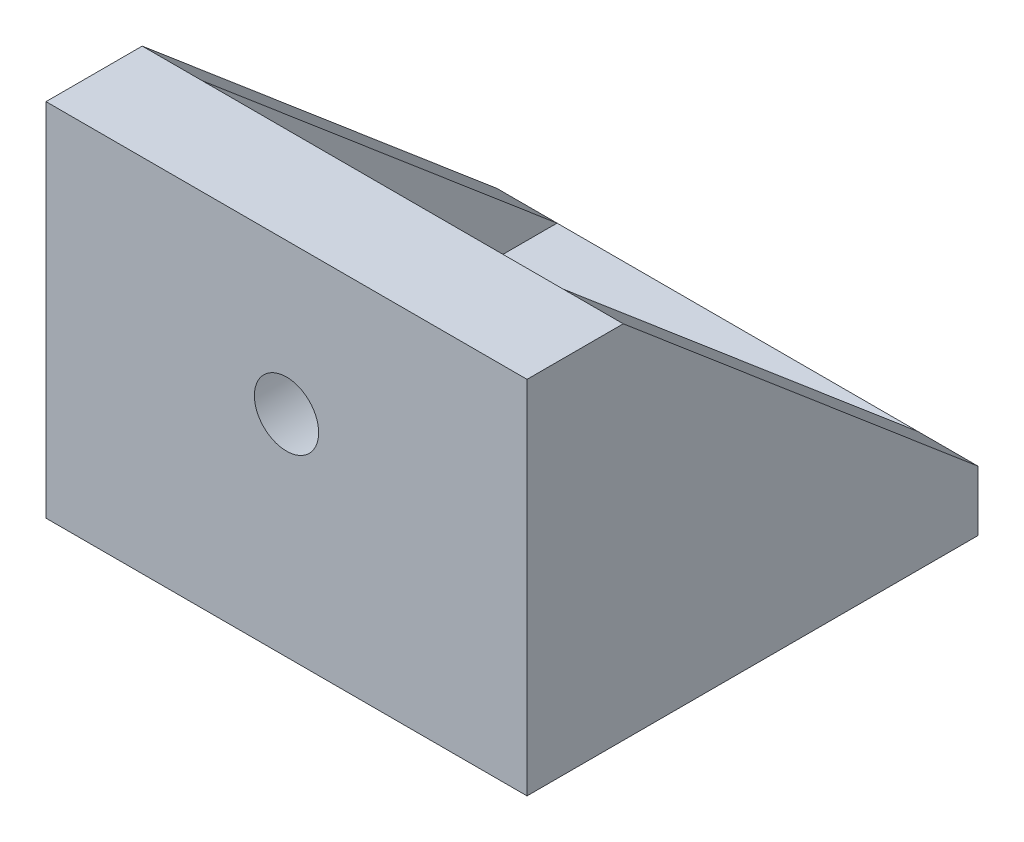
ISO-10303-21;
HEADER;
FILE_DESCRIPTION(('STEP AP214'),'2;1');
FILE_NAME('part.step','',(''),(''),'','','');
FILE_SCHEMA(('AUTOMOTIVE_DESIGN { 1 0 10303 214 1 1 1 1 }'));
ENDSEC;
DATA;
#1=APPLICATION_CONTEXT('core data for automotive mechanical design processes');
#2=APPLICATION_PROTOCOL_DEFINITION('international standard','automotive_design',2000,#1);
#3=PRODUCT_CONTEXT('',#1,'mechanical');
#4=PRODUCT('Part','Part','',(#3));
#5=PRODUCT_RELATED_PRODUCT_CATEGORY('part','',(#4));
#6=PRODUCT_DEFINITION_FORMATION('','',#4);
#7=PRODUCT_DEFINITION_CONTEXT('part definition',#1,'design');
#8=PRODUCT_DEFINITION('design','',#6,#7);
#9=PRODUCT_DEFINITION_SHAPE('','',#8);
#10=(LENGTH_UNIT() NAMED_UNIT(*) SI_UNIT(.MILLI.,.METRE.));
#11=(NAMED_UNIT(*) PLANE_ANGLE_UNIT() SI_UNIT($,.RADIAN.));
#12=(NAMED_UNIT(*) SI_UNIT($,.STERADIAN.) SOLID_ANGLE_UNIT());
#13=UNCERTAINTY_MEASURE_WITH_UNIT(LENGTH_MEASURE(1.E-05),#10,'distance_accuracy_value','');
#14=(GEOMETRIC_REPRESENTATION_CONTEXT(3) GLOBAL_UNCERTAINTY_ASSIGNED_CONTEXT((#13)) GLOBAL_UNIT_ASSIGNED_CONTEXT((#10,
#11,#12)) REPRESENTATION_CONTEXT('',''));
#15=CARTESIAN_POINT('',(0.,0.,0.));
#16=DIRECTION('',(0.,0.,1.));
#17=DIRECTION('',(1.,0.,0.));
#18=AXIS2_PLACEMENT_3D('',#15,#16,#17);
#19=CARTESIAN_POINT('',(0.,5.,0.));
#20=DIRECTION('',(0.,1.,0.));
#21=DIRECTION('',(0.,0.,1.));
#22=AXIS2_PLACEMENT_3D('',#19,#20,#21);
#23=PLANE('',#22);
#24=CARTESIAN_POINT('',(0.,5.,-11.5));
#25=DIRECTION('',(0.,1.,0.));
#26=DIRECTION('',(0.,0.,1.));
#27=AXIS2_PLACEMENT_3D('',#24,#25,#26);
#28=CIRCLE('',#27,3.15);
#29=CARTESIAN_POINT('',(0.,5.,-8.34999999999999));
#30=VERTEX_POINT('',#29);
#31=EDGE_CURVE('E175',#30,#30,#28,.T.);
#32=ORIENTED_EDGE('',*,*,#31,.F.);
#33=EDGE_LOOP('',(#32));
#34=FACE_BOUND('',#33,.T.);
#35=CARTESIAN_POINT('',(-8.6602540378444,5.,3.49999999999999));
#36=DIRECTION('',(0.,1.,0.));
#37=DIRECTION('',(0.,0.,1.));
#38=AXIS2_PLACEMENT_3D('',#35,#36,#37);
#39=CIRCLE('',#38,3.15);
#40=CARTESIAN_POINT('',(-8.6602540378444,5.,6.64999999999999));
#41=VERTEX_POINT('',#40);
#42=EDGE_CURVE('E168',#41,#41,#39,.T.);
#43=ORIENTED_EDGE('',*,*,#42,.F.);
#44=EDGE_LOOP('',(#43));
#45=FACE_BOUND('',#44,.T.);
#46=CARTESIAN_POINT('',(8.6602540378444,5.,3.49999999999999));
#47=DIRECTION('',(0.,1.,0.));
#48=DIRECTION('',(0.,0.,1.));
#49=AXIS2_PLACEMENT_3D('',#46,#47,#48);
#50=CIRCLE('',#49,3.15);
#51=CARTESIAN_POINT('',(8.6602540378444,5.,6.64999999999999));
#52=VERTEX_POINT('',#51);
#53=EDGE_CURVE('E164',#52,#52,#50,.T.);
#54=ORIENTED_EDGE('',*,*,#53,.F.);
#55=EDGE_LOOP('',(#54));
#56=FACE_BOUND('',#55,.T.);
#57=DIRECTION('',(-1.,0.,0.));
#58=VECTOR('',#57,1.);
#59=CARTESIAN_POINT('',(-20.,5.,-18.75));
#60=LINE('',#59,#58);
#61=CARTESIAN_POINT('',(15.,5.,-18.75));
#62=VERTEX_POINT('',#61);
#63=CARTESIAN_POINT('',(-15.,5.,-18.75));
#64=VERTEX_POINT('',#63);
#65=EDGE_CURVE('E134',#62,#64,#60,.T.);
#66=ORIENTED_EDGE('',*,*,#65,.T.);
#67=DIRECTION('',(0.,0.,-1.));
#68=VECTOR('',#67,1.);
#69=CARTESIAN_POINT('',(-15.,5.,-18.75));
#70=LINE('',#69,#68);
#71=CARTESIAN_POINT('',(-15.,5.,10.75));
#72=VERTEX_POINT('',#71);
#73=EDGE_CURVE('E120',#72,#64,#70,.T.);
#74=ORIENTED_EDGE('',*,*,#73,.F.);
#75=DIRECTION('',(-1.,0.,0.));
#76=VECTOR('',#75,1.);
#77=CARTESIAN_POINT('',(0.,5.,10.75));
#78=LINE('',#77,#76);
#79=CARTESIAN_POINT('',(15.,5.,10.75));
#80=VERTEX_POINT('',#79);
#81=EDGE_CURVE('E201',#80,#72,#78,.T.);
#82=ORIENTED_EDGE('',*,*,#81,.F.);
#83=DIRECTION('',(0.,0.,-1.));
#84=VECTOR('',#83,1.);
#85=CARTESIAN_POINT('',(15.,5.,-18.75));
#86=LINE('',#85,#84);
#87=EDGE_CURVE('E138',#80,#62,#86,.T.);
#88=ORIENTED_EDGE('',*,*,#87,.T.);
#89=EDGE_LOOP('',(#66,#74,#82,#88));
#90=FACE_BOUND('',#89,.T.);
#91=ADVANCED_FACE('F41',(#34,#45,#56,#90),#23,.T.);
#92=CARTESIAN_POINT('',(0.,0.,10.75));
#93=DIRECTION('',(0.,0.,1.));
#94=DIRECTION('',(1.,0.,0.));
#95=AXIS2_PLACEMENT_3D('',#92,#93,#94);
#96=PLANE('',#95);
#97=CARTESIAN_POINT('',(0.,17.5,10.75));
#98=DIRECTION('',(0.,0.,-1.));
#99=DIRECTION('',(-1.,0.,0.));
#100=AXIS2_PLACEMENT_3D('',#97,#98,#99);
#101=CIRCLE('',#100,6.);
#102=CARTESIAN_POINT('',(-6.00000000000002,17.5,10.75));
#103=VERTEX_POINT('',#102);
#104=EDGE_CURVE('E420',#103,#103,#101,.T.);
#105=ORIENTED_EDGE('',*,*,#104,.F.);
#106=EDGE_LOOP('',(#105));
#107=FACE_BOUND('',#106,.T.);
#108=DIRECTION('',(0.,-1.,0.));
#109=VECTOR('',#108,1.);
#110=CARTESIAN_POINT('',(-15.,5.,10.75));
#111=LINE('',#110,#109);
#112=CARTESIAN_POINT('',(-15.,30.,10.75));
#113=VERTEX_POINT('',#112);
#114=EDGE_CURVE('E119',#113,#72,#111,.T.);
#115=ORIENTED_EDGE('',*,*,#114,.F.);
#116=DIRECTION('',(-1.,0.,0.));
#117=VECTOR('',#116,1.);
#118=CARTESIAN_POINT('',(0.,30.,10.75));
#119=LINE('',#118,#117);
#120=CARTESIAN_POINT('',(15.,30.,10.75));
#121=VERTEX_POINT('',#120);
#122=EDGE_CURVE('E203',#121,#113,#119,.T.);
#123=ORIENTED_EDGE('',*,*,#122,.F.);
#124=DIRECTION('',(0.,-1.,0.));
#125=VECTOR('',#124,1.);
#126=CARTESIAN_POINT('',(15.,5.,10.75));
#127=LINE('',#126,#125);
#128=EDGE_CURVE('E192',#121,#80,#127,.T.);
#129=ORIENTED_EDGE('',*,*,#128,.T.);
#130=ORIENTED_EDGE('',*,*,#81,.T.);
#131=EDGE_LOOP('',(#115,#123,#129,#130));
#132=FACE_BOUND('',#131,.T.);
#133=ADVANCED_FACE('F229',(#107,#132),#96,.F.);
#134=CARTESIAN_POINT('',(20.,5.,-18.75));
#135=DIRECTION('',(-1.,0.,0.));
#136=DIRECTION('',(0.,0.,1.));
#137=AXIS2_PLACEMENT_3D('',#134,#135,#136);
#138=PLANE('',#137);
#139=DIRECTION('',(0.,-1.,0.));
#140=VECTOR('',#139,1.);
#141=CARTESIAN_POINT('',(20.,5.,-18.75));
#142=LINE('',#141,#140);
#143=CARTESIAN_POINT('',(20.,5.,-18.75));
#144=VERTEX_POINT('',#143);
#145=CARTESIAN_POINT('',(20.,0.,-18.75));
#146=VERTEX_POINT('',#145);
#147=EDGE_CURVE('E11',#144,#146,#142,.T.);
#148=ORIENTED_EDGE('',*,*,#147,.F.);
#149=DIRECTION('',(0.,0.646521695401615,0.762895600573906));
#150=VECTOR('',#149,1.);
#151=CARTESIAN_POINT('',(20.,30.,10.75));
#152=LINE('',#151,#150);
#153=CARTESIAN_POINT('',(20.,30.,10.75));
#154=VERTEX_POINT('',#153);
#155=EDGE_CURVE('E135',#144,#154,#152,.T.);
#156=ORIENTED_EDGE('',*,*,#155,.T.);
#157=DIRECTION('',(0.,0.,1.));
#158=VECTOR('',#157,1.);
#159=CARTESIAN_POINT('',(20.,30.,10.75));
#160=LINE('',#159,#158);
#161=CARTESIAN_POINT('',(20.,30.,18.75));
#162=VERTEX_POINT('',#161);
#163=EDGE_CURVE('E145',#154,#162,#160,.T.);
#164=ORIENTED_EDGE('',*,*,#163,.T.);
#165=DIRECTION('',(0.,-1.,0.));
#166=VECTOR('',#165,1.);
#167=CARTESIAN_POINT('',(20.,5.,18.75));
#168=LINE('',#167,#166);
#169=CARTESIAN_POINT('',(20.,0.,18.75));
#170=VERTEX_POINT('',#169);
#171=EDGE_CURVE('E141',#162,#170,#168,.T.);
#172=ORIENTED_EDGE('',*,*,#171,.T.);
#173=DIRECTION('',(0.,0.,-1.));
#174=VECTOR('',#173,1.);
#175=CARTESIAN_POINT('',(20.,0.,-18.75));
#176=LINE('',#175,#174);
#177=EDGE_CURVE('E147',#170,#146,#176,.T.);
#178=ORIENTED_EDGE('',*,*,#177,.T.);
#179=EDGE_LOOP('',(#148,#156,#164,#172,#178));
#180=FACE_BOUND('',#179,.T.);
#181=ADVANCED_FACE('F43',(#180),#138,.F.);
#182=CARTESIAN_POINT('',(-20.,5.,-18.75));
#183=DIRECTION('',(0.,0.,1.));
#184=DIRECTION('',(1.,0.,0.));
#185=AXIS2_PLACEMENT_3D('',#182,#183,#184);
#186=PLANE('',#185);
#187=DIRECTION('',(-1.,0.,0.));
#188=VECTOR('',#187,1.);
#189=CARTESIAN_POINT('',(-20.,0.,-18.75));
#190=LINE('',#189,#188);
#191=CARTESIAN_POINT('',(-20.,0.,-18.75));
#192=VERTEX_POINT('',#191);
#193=EDGE_CURVE('E150',#146,#192,#190,.T.);
#194=ORIENTED_EDGE('',*,*,#193,.T.);
#195=DIRECTION('',(0.,-1.,0.));
#196=VECTOR('',#195,1.);
#197=CARTESIAN_POINT('',(-20.,5.,-18.75));
#198=LINE('',#197,#196);
#199=CARTESIAN_POINT('',(-20.,5.,-18.75));
#200=VERTEX_POINT('',#199);
#201=EDGE_CURVE('E50',#200,#192,#198,.T.);
#202=ORIENTED_EDGE('',*,*,#201,.F.);
#203=DIRECTION('',(-1.,0.,0.));
#204=VECTOR('',#203,1.);
#205=CARTESIAN_POINT('',(-15.,5.,-18.75));
#206=LINE('',#205,#204);
#207=EDGE_CURVE('E113',#64,#200,#206,.T.);
#208=ORIENTED_EDGE('',*,*,#207,.F.);
#209=ORIENTED_EDGE('',*,*,#65,.F.);
#210=EDGE_CURVE('E139',#144,#62,#60,.T.);
#211=ORIENTED_EDGE('',*,*,#210,.F.);
#212=ORIENTED_EDGE('',*,*,#147,.T.);
#213=EDGE_LOOP('',(#194,#202,#208,#209,#211,#212));
#214=FACE_BOUND('',#213,.T.);
#215=ADVANCED_FACE('F132',(#214),#186,.F.);
#216=CARTESIAN_POINT('',(-20.,5.,-18.75));
#217=DIRECTION('',(1.,0.,0.));
#218=DIRECTION('',(0.,0.,-1.));
#219=AXIS2_PLACEMENT_3D('',#216,#217,#218);
#220=PLANE('',#219);
#221=DIRECTION('',(0.,0.,1.));
#222=VECTOR('',#221,1.);
#223=CARTESIAN_POINT('',(-20.,0.,-18.75));
#224=LINE('',#223,#222);
#225=CARTESIAN_POINT('',(-20.,0.,18.75));
#226=VERTEX_POINT('',#225);
#227=EDGE_CURVE('E66',#192,#226,#224,.T.);
#228=ORIENTED_EDGE('',*,*,#227,.T.);
#229=DIRECTION('',(0.,-1.,0.));
#230=VECTOR('',#229,1.);
#231=CARTESIAN_POINT('',(-20.,5.,18.75));
#232=LINE('',#231,#230);
#233=CARTESIAN_POINT('',(-20.,30.,18.75));
#234=VERTEX_POINT('',#233);
#235=EDGE_CURVE('E155',#234,#226,#232,.T.);
#236=ORIENTED_EDGE('',*,*,#235,.F.);
#237=DIRECTION('',(0.,0.,1.));
#238=VECTOR('',#237,1.);
#239=CARTESIAN_POINT('',(-20.,30.,10.75));
#240=LINE('',#239,#238);
#241=CARTESIAN_POINT('',(-20.,30.,10.75));
#242=VERTEX_POINT('',#241);
#243=EDGE_CURVE('E151',#242,#234,#240,.T.);
#244=ORIENTED_EDGE('',*,*,#243,.F.);
#245=DIRECTION('',(0.,0.646521695401615,0.762895600573906));
#246=VECTOR('',#245,1.);
#247=CARTESIAN_POINT('',(-20.,5.,-18.75));
#248=LINE('',#247,#246);
#249=EDGE_CURVE('E128',#200,#242,#248,.T.);
#250=ORIENTED_EDGE('',*,*,#249,.F.);
#251=ORIENTED_EDGE('',*,*,#201,.T.);
#252=EDGE_LOOP('',(#228,#236,#244,#250,#251));
#253=FACE_BOUND('',#252,.T.);
#254=ADVANCED_FACE('F231',(#253),#220,.F.);
#255=CARTESIAN_POINT('',(-20.,5.,18.75));
#256=DIRECTION('',(0.,0.,-1.));
#257=DIRECTION('',(-1.,0.,0.));
#258=AXIS2_PLACEMENT_3D('',#255,#256,#257);
#259=PLANE('',#258);
#260=CARTESIAN_POINT('',(0.,17.5,18.75));
#261=DIRECTION('',(0.,0.,-1.));
#262=DIRECTION('',(-1.,0.,0.));
#263=AXIS2_PLACEMENT_3D('',#260,#261,#262);
#264=CIRCLE('',#263,2.67144103529897);
#265=CARTESIAN_POINT('',(-2.67144103529898,17.5,18.75));
#266=VERTEX_POINT('',#265);
#267=EDGE_CURVE('E45',#266,#266,#264,.T.);
#268=ORIENTED_EDGE('',*,*,#267,.T.);
#269=EDGE_LOOP('',(#268));
#270=FACE_BOUND('',#269,.T.);
#271=DIRECTION('',(1.,0.,0.));
#272=VECTOR('',#271,1.);
#273=CARTESIAN_POINT('',(-20.,0.,18.75));
#274=LINE('',#273,#272);
#275=EDGE_CURVE('E58',#226,#170,#274,.T.);
#276=ORIENTED_EDGE('',*,*,#275,.T.);
#277=ORIENTED_EDGE('',*,*,#171,.F.);
#278=DIRECTION('',(-1.,0.,0.));
#279=VECTOR('',#278,1.);
#280=CARTESIAN_POINT('',(0.,30.,18.75));
#281=LINE('',#280,#279);
#282=EDGE_CURVE('E199',#162,#234,#281,.T.);
#283=ORIENTED_EDGE('',*,*,#282,.T.);
#284=ORIENTED_EDGE('',*,*,#235,.T.);
#285=EDGE_LOOP('',(#276,#277,#283,#284));
#286=FACE_BOUND('',#285,.T.);
#287=ADVANCED_FACE('F219',(#270,#286),#259,.F.);
#288=CARTESIAN_POINT('',(0.,0.,0.));
#289=DIRECTION('',(0.,1.,0.));
#290=DIRECTION('',(0.,0.,1.));
#291=AXIS2_PLACEMENT_3D('',#288,#289,#290);
#292=PLANE('',#291);
#293=CARTESIAN_POINT('',(0.,0.,-11.5));
#294=DIRECTION('',(0.,1.,0.));
#295=DIRECTION('',(0.,0.,1.));
#296=AXIS2_PLACEMENT_3D('',#293,#294,#295);
#297=CIRCLE('',#296,1.7);
#298=CARTESIAN_POINT('',(0.,0.,-9.79999999999999));
#299=VERTEX_POINT('',#298);
#300=EDGE_CURVE('E166',#299,#299,#297,.T.);
#301=ORIENTED_EDGE('',*,*,#300,.T.);
#302=EDGE_LOOP('',(#301));
#303=FACE_BOUND('',#302,.T.);
#304=CARTESIAN_POINT('',(-8.6602540378444,0.,3.49999999999999));
#305=DIRECTION('',(0.,1.,0.));
#306=DIRECTION('',(0.,0.,1.));
#307=AXIS2_PLACEMENT_3D('',#304,#305,#306);
#308=CIRCLE('',#307,1.7);
#309=CARTESIAN_POINT('',(-8.6602540378444,0.,5.19999999999999));
#310=VERTEX_POINT('',#309);
#311=EDGE_CURVE('E162',#310,#310,#308,.T.);
#312=ORIENTED_EDGE('',*,*,#311,.T.);
#313=EDGE_LOOP('',(#312));
#314=FACE_BOUND('',#313,.T.);
#315=CARTESIAN_POINT('',(8.6602540378444,0.,3.49999999999999));
#316=DIRECTION('',(0.,1.,0.));
#317=DIRECTION('',(0.,0.,1.));
#318=AXIS2_PLACEMENT_3D('',#315,#316,#317);
#319=CIRCLE('',#318,1.7);
#320=CARTESIAN_POINT('',(8.6602540378444,0.,5.19999999999999));
#321=VERTEX_POINT('',#320);
#322=EDGE_CURVE('E158',#321,#321,#319,.T.);
#323=ORIENTED_EDGE('',*,*,#322,.T.);
#324=EDGE_LOOP('',(#323));
#325=FACE_BOUND('',#324,.T.);
#326=ORIENTED_EDGE('',*,*,#177,.F.);
#327=ORIENTED_EDGE('',*,*,#275,.F.);
#328=ORIENTED_EDGE('',*,*,#227,.F.);
#329=ORIENTED_EDGE('',*,*,#193,.F.);
#330=EDGE_LOOP('',(#326,#327,#328,#329));
#331=FACE_BOUND('',#330,.T.);
#332=ADVANCED_FACE('F221',(#303,#314,#325,#331),#292,.F.);
#333=CARTESIAN_POINT('',(0.,30.,10.75));
#334=DIRECTION('',(0.,1.,0.));
#335=DIRECTION('',(0.,0.,1.));
#336=AXIS2_PLACEMENT_3D('',#333,#334,#335);
#337=PLANE('',#336);
#338=ORIENTED_EDGE('',*,*,#282,.F.);
#339=ORIENTED_EDGE('',*,*,#163,.F.);
#340=EDGE_CURVE('E204',#154,#121,#119,.T.);
#341=ORIENTED_EDGE('',*,*,#340,.T.);
#342=ORIENTED_EDGE('',*,*,#122,.T.);
#343=DIRECTION('',(-1.,0.,0.));
#344=VECTOR('',#343,1.);
#345=CARTESIAN_POINT('',(-15.,30.,10.75));
#346=LINE('',#345,#344);
#347=EDGE_CURVE('E116',#113,#242,#346,.T.);
#348=ORIENTED_EDGE('',*,*,#347,.T.);
#349=ORIENTED_EDGE('',*,*,#243,.T.);
#350=EDGE_LOOP('',(#338,#339,#341,#342,#348,#349));
#351=FACE_BOUND('',#350,.T.);
#352=ADVANCED_FACE('F218',(#351),#337,.T.);
#353=CARTESIAN_POINT('',(15.,30.,10.75));
#354=DIRECTION('',(0.,0.762895600573906,-0.646521695401615));
#355=DIRECTION('',(0.,0.646521695401615,0.762895600573906));
#356=AXIS2_PLACEMENT_3D('',#353,#354,#355);
#357=PLANE('',#356);
#358=ORIENTED_EDGE('',*,*,#155,.F.);
#359=ORIENTED_EDGE('',*,*,#210,.T.);
#360=DIRECTION('',(0.,0.646521695401615,0.762895600573906));
#361=VECTOR('',#360,1.);
#362=CARTESIAN_POINT('',(15.,30.,10.75));
#363=LINE('',#362,#361);
#364=EDGE_CURVE('E196',#62,#121,#363,.T.);
#365=ORIENTED_EDGE('',*,*,#364,.T.);
#366=ORIENTED_EDGE('',*,*,#340,.F.);
#367=EDGE_LOOP('',(#358,#359,#365,#366));
#368=FACE_BOUND('',#367,.T.);
#369=ADVANCED_FACE('F224',(#368),#357,.T.);
#370=CARTESIAN_POINT('',(15.,0.,0.));
#371=DIRECTION('',(1.,0.,0.));
#372=DIRECTION('',(0.,0.,-1.));
#373=AXIS2_PLACEMENT_3D('',#370,#371,#372);
#374=PLANE('',#373);
#375=ORIENTED_EDGE('',*,*,#128,.F.);
#376=ORIENTED_EDGE('',*,*,#364,.F.);
#377=ORIENTED_EDGE('',*,*,#87,.F.);
#378=EDGE_LOOP('',(#375,#376,#377));
#379=FACE_BOUND('',#378,.T.);
#380=ADVANCED_FACE('F227',(#379),#374,.F.);
#381=CARTESIAN_POINT('',(-15.,5.,-18.75));
#382=DIRECTION('',(0.,-0.762895600573906,0.646521695401615));
#383=DIRECTION('',(0.,-0.646521695401615,-0.762895600573906));
#384=AXIS2_PLACEMENT_3D('',#381,#382,#383);
#385=PLANE('',#384);
#386=ORIENTED_EDGE('',*,*,#249,.T.);
#387=ORIENTED_EDGE('',*,*,#347,.F.);
#388=DIRECTION('',(0.,0.646521695401615,0.762895600573906));
#389=VECTOR('',#388,1.);
#390=CARTESIAN_POINT('',(-15.,5.,-18.75));
#391=LINE('',#390,#389);
#392=EDGE_CURVE('E109',#64,#113,#391,.T.);
#393=ORIENTED_EDGE('',*,*,#392,.F.);
#394=ORIENTED_EDGE('',*,*,#207,.T.);
#395=EDGE_LOOP('',(#386,#387,#393,#394));
#396=FACE_BOUND('',#395,.T.);
#397=ADVANCED_FACE('F111',(#396),#385,.F.);
#398=CARTESIAN_POINT('',(-15.,0.,0.));
#399=DIRECTION('',(-1.,0.,0.));
#400=DIRECTION('',(0.,0.,1.));
#401=AXIS2_PLACEMENT_3D('',#398,#399,#400);
#402=PLANE('',#401);
#403=ORIENTED_EDGE('',*,*,#73,.T.);
#404=ORIENTED_EDGE('',*,*,#392,.T.);
#405=ORIENTED_EDGE('',*,*,#114,.T.);
#406=EDGE_LOOP('',(#403,#404,#405));
#407=FACE_BOUND('',#406,.T.);
#408=ADVANCED_FACE('F123',(#407),#402,.F.);
#409=CARTESIAN_POINT('',(8.6602540378444,5.,3.49999999999999));
#410=DIRECTION('',(0.,1.,0.));
#411=DIRECTION('',(0.,0.,1.));
#412=AXIS2_PLACEMENT_3D('',#409,#410,#411);
#413=CYLINDRICAL_SURFACE('',#412,1.7);
#414=CARTESIAN_POINT('',(8.6602540378444,3.55,3.49999999999999));
#415=DIRECTION('',(0.,1.,0.));
#416=DIRECTION('',(0.,0.,1.));
#417=AXIS2_PLACEMENT_3D('',#414,#415,#416);
#418=CIRCLE('',#417,1.7);
#419=CARTESIAN_POINT('',(8.6602540378444,3.55,5.19999999999999));
#420=VERTEX_POINT('',#419);
#421=EDGE_CURVE('E161',#420,#420,#418,.T.);
#422=ORIENTED_EDGE('',*,*,#421,.T.);
#423=EDGE_LOOP('',(#422));
#424=FACE_BOUND('',#423,.T.);
#425=ORIENTED_EDGE('',*,*,#322,.F.);
#426=EDGE_LOOP('',(#425));
#427=FACE_BOUND('',#426,.T.);
#428=ADVANCED_FACE('F263',(#424,#427),#413,.F.);
#429=CARTESIAN_POINT('',(8.6602540378444,5.,3.49999999999999));
#430=DIRECTION('',(0.,1.,0.));
#431=DIRECTION('',(0.,0.,1.));
#432=AXIS2_PLACEMENT_3D('',#429,#430,#431);
#433=CONICAL_SURFACE('',#432,3.15,0.785398163397448);
#434=ORIENTED_EDGE('',*,*,#421,.F.);
#435=EDGE_LOOP('',(#434));
#436=FACE_BOUND('',#435,.T.);
#437=ORIENTED_EDGE('',*,*,#53,.T.);
#438=EDGE_LOOP('',(#437));
#439=FACE_BOUND('',#438,.T.);
#440=ADVANCED_FACE('F264',(#436,#439),#433,.F.);
#441=CARTESIAN_POINT('',(-8.6602540378444,5.,3.49999999999999));
#442=DIRECTION('',(0.,1.,0.));
#443=DIRECTION('',(0.,0.,1.));
#444=AXIS2_PLACEMENT_3D('',#441,#442,#443);
#445=CYLINDRICAL_SURFACE('',#444,1.7);
#446=CARTESIAN_POINT('',(-8.6602540378444,3.55,3.49999999999999));
#447=DIRECTION('',(0.,1.,0.));
#448=DIRECTION('',(0.,0.,1.));
#449=AXIS2_PLACEMENT_3D('',#446,#447,#448);
#450=CIRCLE('',#449,1.7);
#451=CARTESIAN_POINT('',(-8.6602540378444,3.55,5.19999999999999));
#452=VERTEX_POINT('',#451);
#453=EDGE_CURVE('E165',#452,#452,#450,.T.);
#454=ORIENTED_EDGE('',*,*,#453,.T.);
#455=EDGE_LOOP('',(#454));
#456=FACE_BOUND('',#455,.T.);
#457=ORIENTED_EDGE('',*,*,#311,.F.);
#458=EDGE_LOOP('',(#457));
#459=FACE_BOUND('',#458,.T.);
#460=ADVANCED_FACE('F270',(#456,#459),#445,.F.);
#461=CARTESIAN_POINT('',(-8.6602540378444,5.,3.49999999999999));
#462=DIRECTION('',(0.,1.,0.));
#463=DIRECTION('',(0.,0.,1.));
#464=AXIS2_PLACEMENT_3D('',#461,#462,#463);
#465=CONICAL_SURFACE('',#464,3.15,0.785398163397448);
#466=ORIENTED_EDGE('',*,*,#453,.F.);
#467=EDGE_LOOP('',(#466));
#468=FACE_BOUND('',#467,.T.);
#469=ORIENTED_EDGE('',*,*,#42,.T.);
#470=EDGE_LOOP('',(#469));
#471=FACE_BOUND('',#470,.T.);
#472=ADVANCED_FACE('F363',(#468,#471),#465,.F.);
#473=CARTESIAN_POINT('',(0.,5.,-11.5));
#474=DIRECTION('',(0.,1.,0.));
#475=DIRECTION('',(0.,0.,1.));
#476=AXIS2_PLACEMENT_3D('',#473,#474,#475);
#477=CYLINDRICAL_SURFACE('',#476,1.7);
#478=CARTESIAN_POINT('',(0.,3.55,-11.5));
#479=DIRECTION('',(0.,1.,0.));
#480=DIRECTION('',(0.,0.,1.));
#481=AXIS2_PLACEMENT_3D('',#478,#479,#480);
#482=CIRCLE('',#481,1.7);
#483=CARTESIAN_POINT('',(0.,3.55,-9.79999999999999));
#484=VERTEX_POINT('',#483);
#485=EDGE_CURVE('E169',#484,#484,#482,.T.);
#486=ORIENTED_EDGE('',*,*,#485,.T.);
#487=EDGE_LOOP('',(#486));
#488=FACE_BOUND('',#487,.T.);
#489=ORIENTED_EDGE('',*,*,#300,.F.);
#490=EDGE_LOOP('',(#489));
#491=FACE_BOUND('',#490,.T.);
#492=ADVANCED_FACE('F372',(#488,#491),#477,.F.);
#493=CARTESIAN_POINT('',(0.,5.,-11.5));
#494=DIRECTION('',(0.,1.,0.));
#495=DIRECTION('',(0.,0.,1.));
#496=AXIS2_PLACEMENT_3D('',#493,#494,#495);
#497=CONICAL_SURFACE('',#496,3.15,0.785398163397448);
#498=ORIENTED_EDGE('',*,*,#485,.F.);
#499=EDGE_LOOP('',(#498));
#500=FACE_BOUND('',#499,.T.);
#501=ORIENTED_EDGE('',*,*,#31,.T.);
#502=EDGE_LOOP('',(#501));
#503=FACE_BOUND('',#502,.T.);
#504=ADVANCED_FACE('F382',(#500,#503),#497,.F.);
#505=CARTESIAN_POINT('',(0.,17.5,16.75));
#506=DIRECTION('',(0.,0.,-1.));
#507=DIRECTION('',(-1.,0.,0.));
#508=AXIS2_PLACEMENT_3D('',#505,#506,#507);
#509=CONICAL_SURFACE('',#508,6.,1.02974425867665);
#510=CARTESIAN_POINT('',(0.,17.5,16.75));
#511=DIRECTION('',(0.,0.,-1.));
#512=DIRECTION('',(-1.,0.,0.));
#513=AXIS2_PLACEMENT_3D('',#510,#511,#512);
#514=CIRCLE('',#513,6.);
#515=CARTESIAN_POINT('',(-6.00000000000002,17.5,16.75));
#516=VERTEX_POINT('',#515);
#517=EDGE_CURVE('E417',#516,#516,#514,.T.);
#518=ORIENTED_EDGE('',*,*,#517,.T.);
#519=EDGE_LOOP('',(#518));
#520=FACE_BOUND('',#519,.T.);
#521=ORIENTED_EDGE('',*,*,#267,.F.);
#522=EDGE_LOOP('',(#521));
#523=FACE_BOUND('',#522,.T.);
#524=ADVANCED_FACE('F391',(#520,#523),#509,.F.);
#525=CARTESIAN_POINT('',(0.,17.5,10.75));
#526=DIRECTION('',(0.,0.,-1.));
#527=DIRECTION('',(-1.,0.,0.));
#528=AXIS2_PLACEMENT_3D('',#525,#526,#527);
#529=CYLINDRICAL_SURFACE('',#528,6.);
#530=ORIENTED_EDGE('',*,*,#517,.F.);
#531=EDGE_LOOP('',(#530));
#532=FACE_BOUND('',#531,.T.);
#533=ORIENTED_EDGE('',*,*,#104,.T.);
#534=EDGE_LOOP('',(#533));
#535=FACE_BOUND('',#534,.T.);
#536=ADVANCED_FACE('F401',(#532,#535),#529,.F.);
#537=CLOSED_SHELL('',(#91,#133,#181,#215,#254,#287,#332,#352,#369,#380,#397,#408,#428,#440,#460,
#472,#492,#504,#524,#536));
#538=MANIFOLD_SOLID_BREP('B2',#537);
#539=ADVANCED_BREP_SHAPE_REPRESENTATION('',(#18,#538),#14);
#540=SHAPE_DEFINITION_REPRESENTATION(#9,#539);
ENDSEC;
END-ISO-10303-21;
